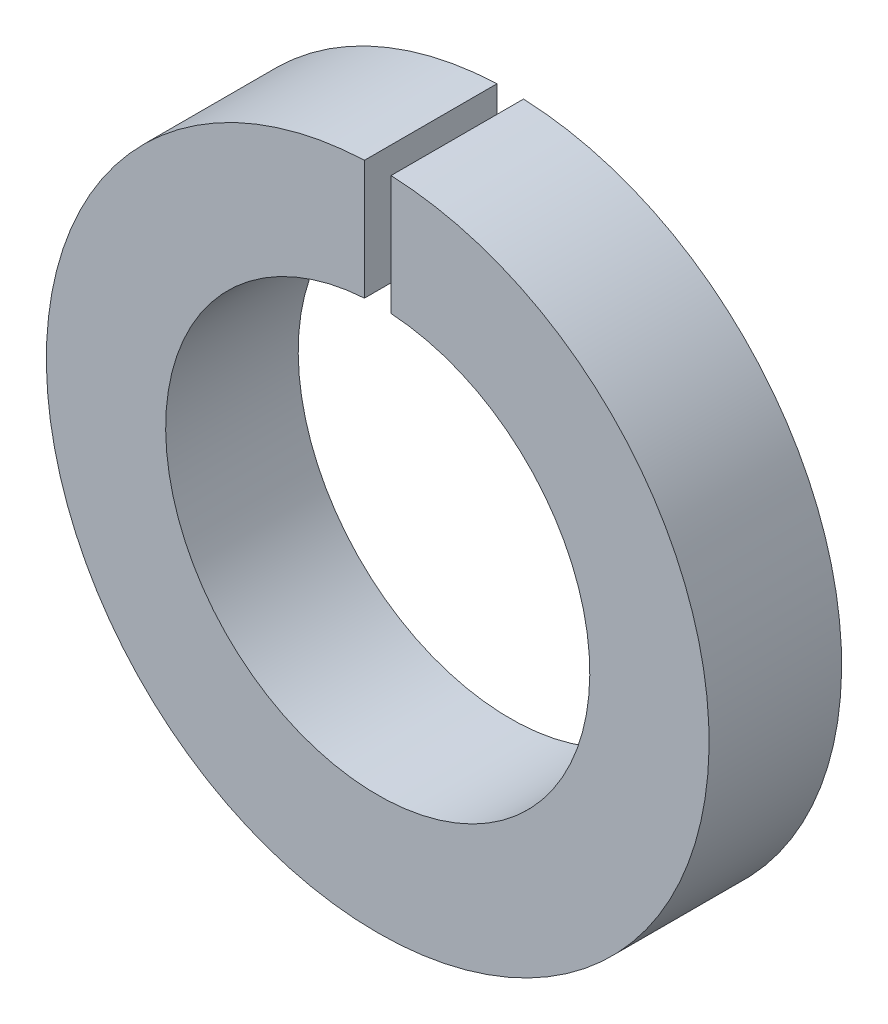
ISO-10303-21;
HEADER;
FILE_DESCRIPTION(('STEP AP214'),'2;1');
FILE_NAME('part.step','',(''),(''),'','','');
FILE_SCHEMA(('AUTOMOTIVE_DESIGN { 1 0 10303 214 1 1 1 1 }'));
ENDSEC;
DATA;
#1=APPLICATION_CONTEXT('core data for automotive mechanical design processes');
#2=APPLICATION_PROTOCOL_DEFINITION('international standard','automotive_design',2000,#1);
#3=PRODUCT_CONTEXT('',#1,'mechanical');
#4=PRODUCT('Part','Part','',(#3));
#5=PRODUCT_RELATED_PRODUCT_CATEGORY('part','',(#4));
#6=PRODUCT_DEFINITION_FORMATION('','',#4);
#7=PRODUCT_DEFINITION_CONTEXT('part definition',#1,'design');
#8=PRODUCT_DEFINITION('design','',#6,#7);
#9=PRODUCT_DEFINITION_SHAPE('','',#8);
#10=(LENGTH_UNIT() NAMED_UNIT(*) SI_UNIT(.MILLI.,.METRE.));
#11=(NAMED_UNIT(*) PLANE_ANGLE_UNIT() SI_UNIT($,.RADIAN.));
#12=(NAMED_UNIT(*) SI_UNIT($,.STERADIAN.) SOLID_ANGLE_UNIT());
#13=UNCERTAINTY_MEASURE_WITH_UNIT(LENGTH_MEASURE(1.E-05),#10,'distance_accuracy_value','');
#14=(GEOMETRIC_REPRESENTATION_CONTEXT(3) GLOBAL_UNCERTAINTY_ASSIGNED_CONTEXT((#13)) GLOBAL_UNIT_ASSIGNED_CONTEXT((#10,
#11,#12)) REPRESENTATION_CONTEXT('',''));
#15=CARTESIAN_POINT('',(0.,0.,0.));
#16=DIRECTION('',(0.,0.,1.));
#17=DIRECTION('',(1.,0.,0.));
#18=AXIS2_PLACEMENT_3D('',#15,#16,#17);
#19=CARTESIAN_POINT('',(0.,0.,1.));
#20=DIRECTION('',(0.,0.,1.));
#21=DIRECTION('',(1.,0.,0.));
#22=AXIS2_PLACEMENT_3D('',#19,#20,#21);
#23=PLANE('',#22);
#24=DIRECTION('',(0.,1.,0.));
#25=VECTOR('',#24,1.);
#26=CARTESIAN_POINT('',(0.1,-0.247154471544719,1.));
#27=LINE('',#26,#25);
#28=CARTESIAN_POINT('',(0.1,1.59687194226713,1.));
#29=VERTEX_POINT('',#28);
#30=CARTESIAN_POINT('',(0.1,2.49799919935936,1.));
#31=VERTEX_POINT('',#30);
#32=EDGE_CURVE('E57',#29,#31,#27,.T.);
#33=ORIENTED_EDGE('',*,*,#32,.F.);
#34=CARTESIAN_POINT('',(0.,0.,1.));
#35=DIRECTION('',(0.,0.,1.));
#36=DIRECTION('',(1.,0.,0.));
#37=AXIS2_PLACEMENT_3D('',#34,#35,#36);
#38=CIRCLE('',#37,1.6);
#39=CARTESIAN_POINT('',(-0.1,1.59687194226713,1.));
#40=VERTEX_POINT('',#39);
#41=EDGE_CURVE('E65',#40,#29,#38,.T.);
#42=ORIENTED_EDGE('',*,*,#41,.F.);
#43=DIRECTION('',(0.,-1.,0.));
#44=VECTOR('',#43,1.);
#45=CARTESIAN_POINT('',(-0.1,-0.247154471544719,1.));
#46=LINE('',#45,#44);
#47=CARTESIAN_POINT('',(-0.1,2.49799919935936,1.));
#48=VERTEX_POINT('',#47);
#49=EDGE_CURVE('E39',#48,#40,#46,.T.);
#50=ORIENTED_EDGE('',*,*,#49,.F.);
#51=CARTESIAN_POINT('',(0.,0.,1.));
#52=DIRECTION('',(0.,0.,1.));
#53=DIRECTION('',(1.,0.,0.));
#54=AXIS2_PLACEMENT_3D('',#51,#52,#53);
#55=CIRCLE('',#54,2.5);
#56=EDGE_CURVE('E70',#48,#31,#55,.T.);
#57=ORIENTED_EDGE('',*,*,#56,.T.);
#58=EDGE_LOOP('',(#33,#42,#50,#57));
#59=FACE_BOUND('',#58,.T.);
#60=ADVANCED_FACE('F17',(#59),#23,.T.);
#61=CARTESIAN_POINT('',(0.,0.,0.));
#62=DIRECTION('',(0.,0.,1.));
#63=DIRECTION('',(1.,0.,0.));
#64=AXIS2_PLACEMENT_3D('',#61,#62,#63);
#65=PLANE('',#64);
#66=CARTESIAN_POINT('',(0.,0.,0.));
#67=DIRECTION('',(0.,0.,1.));
#68=DIRECTION('',(1.,0.,0.));
#69=AXIS2_PLACEMENT_3D('',#66,#67,#68);
#70=CIRCLE('',#69,1.6);
#71=CARTESIAN_POINT('',(-0.1,1.59687194226713,0.));
#72=VERTEX_POINT('',#71);
#73=CARTESIAN_POINT('',(0.1,1.59687194226713,0.));
#74=VERTEX_POINT('',#73);
#75=EDGE_CURVE('E75',#72,#74,#70,.T.);
#76=ORIENTED_EDGE('',*,*,#75,.T.);
#77=DIRECTION('',(0.,1.,0.));
#78=VECTOR('',#77,1.);
#79=CARTESIAN_POINT('',(0.1,-0.247154471544719,0.));
#80=LINE('',#79,#78);
#81=CARTESIAN_POINT('',(0.1,2.49799919935936,0.));
#82=VERTEX_POINT('',#81);
#83=EDGE_CURVE('E33',#74,#82,#80,.T.);
#84=ORIENTED_EDGE('',*,*,#83,.T.);
#85=CARTESIAN_POINT('',(0.,0.,0.));
#86=DIRECTION('',(0.,0.,1.));
#87=DIRECTION('',(1.,0.,0.));
#88=AXIS2_PLACEMENT_3D('',#85,#86,#87);
#89=CIRCLE('',#88,2.5);
#90=CARTESIAN_POINT('',(-0.1,2.49799919935936,0.));
#91=VERTEX_POINT('',#90);
#92=EDGE_CURVE('E68',#91,#82,#89,.T.);
#93=ORIENTED_EDGE('',*,*,#92,.F.);
#94=DIRECTION('',(0.,-1.,0.));
#95=VECTOR('',#94,1.);
#96=CARTESIAN_POINT('',(-0.1,-0.247154471544719,0.));
#97=LINE('',#96,#95);
#98=EDGE_CURVE('E85',#91,#72,#97,.T.);
#99=ORIENTED_EDGE('',*,*,#98,.T.);
#100=EDGE_LOOP('',(#76,#84,#93,#99));
#101=FACE_BOUND('',#100,.T.);
#102=ADVANCED_FACE('F88',(#101),#65,.F.);
#103=CARTESIAN_POINT('',(0.,0.,1.));
#104=DIRECTION('',(0.,0.,-1.));
#105=DIRECTION('',(-1.,0.,0.));
#106=AXIS2_PLACEMENT_3D('',#103,#104,#105);
#107=CYLINDRICAL_SURFACE('',#106,2.5);
#108=ORIENTED_EDGE('',*,*,#92,.T.);
#109=DIRECTION('',(0.,0.,-1.));
#110=VECTOR('',#109,1.);
#111=CARTESIAN_POINT('',(0.1,2.49799919935936,1.));
#112=LINE('',#111,#110);
#113=EDGE_CURVE('E74',#82,#31,#112,.F.);
#114=ORIENTED_EDGE('',*,*,#113,.T.);
#115=ORIENTED_EDGE('',*,*,#56,.F.);
#116=DIRECTION('',(0.,0.,-1.));
#117=VECTOR('',#116,1.);
#118=CARTESIAN_POINT('',(-0.1,2.49799919935936,1.));
#119=LINE('',#118,#117);
#120=EDGE_CURVE('E87',#48,#91,#119,.T.);
#121=ORIENTED_EDGE('',*,*,#120,.T.);
#122=EDGE_LOOP('',(#108,#114,#115,#121));
#123=FACE_BOUND('',#122,.T.);
#124=ADVANCED_FACE('F19',(#123),#107,.T.);
#125=CARTESIAN_POINT('',(0.,0.,1.));
#126=DIRECTION('',(0.,0.,-1.));
#127=DIRECTION('',(-1.,0.,0.));
#128=AXIS2_PLACEMENT_3D('',#125,#126,#127);
#129=CYLINDRICAL_SURFACE('',#128,1.6);
#130=DIRECTION('',(0.,0.,-1.));
#131=VECTOR('',#130,1.);
#132=CARTESIAN_POINT('',(0.1,1.59687194226713,1.));
#133=LINE('',#132,#131);
#134=EDGE_CURVE('E11',#74,#29,#133,.F.);
#135=ORIENTED_EDGE('',*,*,#134,.F.);
#136=ORIENTED_EDGE('',*,*,#75,.F.);
#137=DIRECTION('',(0.,0.,-1.));
#138=VECTOR('',#137,1.);
#139=CARTESIAN_POINT('',(-0.1,1.59687194226713,1.));
#140=LINE('',#139,#138);
#141=EDGE_CURVE('E25',#40,#72,#140,.T.);
#142=ORIENTED_EDGE('',*,*,#141,.F.);
#143=ORIENTED_EDGE('',*,*,#41,.T.);
#144=EDGE_LOOP('',(#135,#136,#142,#143));
#145=FACE_BOUND('',#144,.T.);
#146=ADVANCED_FACE('F66',(#145),#129,.F.);
#147=CARTESIAN_POINT('',(-0.1,-0.247154471544719,0.));
#148=DIRECTION('',(-1.,0.,0.));
#149=DIRECTION('',(0.,0.,1.));
#150=AXIS2_PLACEMENT_3D('',#147,#148,#149);
#151=PLANE('',#150);
#152=ORIENTED_EDGE('',*,*,#49,.T.);
#153=ORIENTED_EDGE('',*,*,#141,.T.);
#154=ORIENTED_EDGE('',*,*,#98,.F.);
#155=ORIENTED_EDGE('',*,*,#120,.F.);
#156=EDGE_LOOP('',(#152,#153,#154,#155));
#157=FACE_BOUND('',#156,.T.);
#158=ADVANCED_FACE('F81',(#157),#151,.F.);
#159=CARTESIAN_POINT('',(0.1,-0.247154471544719,0.));
#160=DIRECTION('',(1.,0.,0.));
#161=DIRECTION('',(0.,0.,-1.));
#162=AXIS2_PLACEMENT_3D('',#159,#160,#161);
#163=PLANE('',#162);
#164=ORIENTED_EDGE('',*,*,#83,.F.);
#165=ORIENTED_EDGE('',*,*,#134,.T.);
#166=ORIENTED_EDGE('',*,*,#32,.T.);
#167=ORIENTED_EDGE('',*,*,#113,.F.);
#168=EDGE_LOOP('',(#164,#165,#166,#167));
#169=FACE_BOUND('',#168,.T.);
#170=ADVANCED_FACE('F54',(#169),#163,.F.);
#171=CLOSED_SHELL('',(#60,#102,#124,#146,#158,#170));
#172=MANIFOLD_SOLID_BREP('B1',#171);
#173=ADVANCED_BREP_SHAPE_REPRESENTATION('',(#18,#172),#14);
#174=SHAPE_DEFINITION_REPRESENTATION(#9,#173);
ENDSEC;
END-ISO-10303-21;
